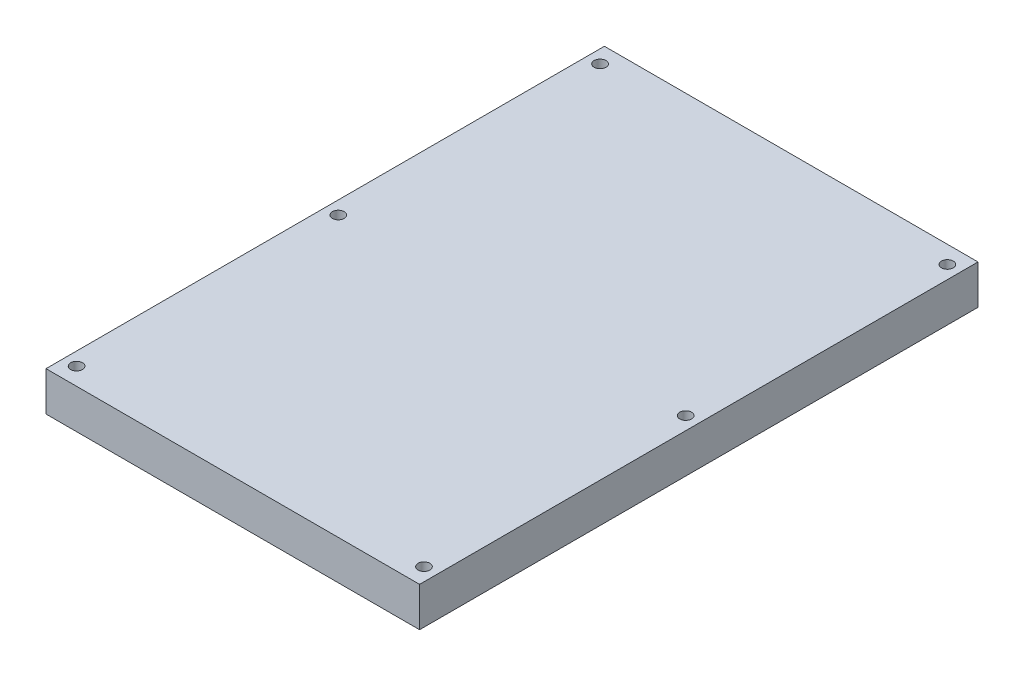
ISO-10303-21;
HEADER;
FILE_DESCRIPTION(('STEP AP214'),'2;1');
FILE_NAME('part.step','',(''),(''),'','','');
FILE_SCHEMA(('AUTOMOTIVE_DESIGN { 1 0 10303 214 1 1 1 1 }'));
ENDSEC;
DATA;
#1=APPLICATION_CONTEXT('core data for automotive mechanical design processes');
#2=APPLICATION_PROTOCOL_DEFINITION('international standard','automotive_design',2000,#1);
#3=PRODUCT_CONTEXT('',#1,'mechanical');
#4=PRODUCT('Part','Part','',(#3));
#5=PRODUCT_RELATED_PRODUCT_CATEGORY('part','',(#4));
#6=PRODUCT_DEFINITION_FORMATION('','',#4);
#7=PRODUCT_DEFINITION_CONTEXT('part definition',#1,'design');
#8=PRODUCT_DEFINITION('design','',#6,#7);
#9=PRODUCT_DEFINITION_SHAPE('','',#8);
#10=(LENGTH_UNIT() NAMED_UNIT(*) SI_UNIT(.MILLI.,.METRE.));
#11=(NAMED_UNIT(*) PLANE_ANGLE_UNIT() SI_UNIT($,.RADIAN.));
#12=(NAMED_UNIT(*) SI_UNIT($,.STERADIAN.) SOLID_ANGLE_UNIT());
#13=UNCERTAINTY_MEASURE_WITH_UNIT(LENGTH_MEASURE(1.E-05),#10,'distance_accuracy_value','');
#14=(GEOMETRIC_REPRESENTATION_CONTEXT(3) GLOBAL_UNCERTAINTY_ASSIGNED_CONTEXT((#13)) GLOBAL_UNIT_ASSIGNED_CONTEXT((#10,
#11,#12)) REPRESENTATION_CONTEXT('',''));
#15=CARTESIAN_POINT('',(0.,0.,0.));
#16=DIRECTION('',(0.,0.,1.));
#17=DIRECTION('',(1.,0.,0.));
#18=AXIS2_PLACEMENT_3D('',#15,#16,#17);
#19=CARTESIAN_POINT('',(82.5,9.,-123.8));
#20=DIRECTION('',(0.,1.,0.));
#21=DIRECTION('',(0.,0.,1.));
#22=AXIS2_PLACEMENT_3D('',#19,#20,#21);
#23=CYLINDRICAL_SURFACE('',#22,1.35254999999999);
#24=CARTESIAN_POINT('',(82.5,0.,-123.8));
#25=DIRECTION('',(0.,1.,0.));
#26=DIRECTION('',(0.,0.,1.));
#27=AXIS2_PLACEMENT_3D('',#24,#25,#26);
#28=CIRCLE('',#27,1.35254999999999);
#29=CARTESIAN_POINT('',(82.5,0.,-122.44745));
#30=VERTEX_POINT('',#29);
#31=EDGE_CURVE('E43',#30,#30,#28,.T.);
#32=ORIENTED_EDGE('',*,*,#31,.F.);
#33=EDGE_LOOP('',(#32));
#34=FACE_BOUND('',#33,.T.);
#35=CARTESIAN_POINT('',(82.5,9.,-123.8));
#36=DIRECTION('',(0.,1.,0.));
#37=DIRECTION('',(0.,0.,1.));
#38=AXIS2_PLACEMENT_3D('',#35,#36,#37);
#39=CIRCLE('',#38,1.35254999999999);
#40=CARTESIAN_POINT('',(82.5,9.,-122.44745));
#41=VERTEX_POINT('',#40);
#42=EDGE_CURVE('E11',#41,#41,#39,.T.);
#43=ORIENTED_EDGE('',*,*,#42,.T.);
#44=EDGE_LOOP('',(#43));
#45=FACE_BOUND('',#44,.T.);
#46=ADVANCED_FACE('F35',(#34,#45),#23,.F.);
#47=CARTESIAN_POINT('',(0.,9.,0.));
#48=DIRECTION('',(1.,0.,0.));
#49=DIRECTION('',(0.,0.,-1.));
#50=AXIS2_PLACEMENT_3D('',#47,#48,#49);
#51=PLANE('',#50);
#52=DIRECTION('',(0.,0.,1.));
#53=VECTOR('',#52,1.);
#54=CARTESIAN_POINT('',(0.,0.,0.));
#55=LINE('',#54,#53);
#56=CARTESIAN_POINT('',(0.,0.,-127.8));
#57=VERTEX_POINT('',#56);
#58=CARTESIAN_POINT('',(0.,0.,0.));
#59=VERTEX_POINT('',#58);
#60=EDGE_CURVE('E103',#57,#59,#55,.T.);
#61=ORIENTED_EDGE('',*,*,#60,.T.);
#62=DIRECTION('',(0.,-1.,0.));
#63=VECTOR('',#62,1.);
#64=CARTESIAN_POINT('',(0.,9.,0.));
#65=LINE('',#64,#63);
#66=CARTESIAN_POINT('',(0.,9.,0.));
#67=VERTEX_POINT('',#66);
#68=EDGE_CURVE('E94',#67,#59,#65,.T.);
#69=ORIENTED_EDGE('',*,*,#68,.F.);
#70=DIRECTION('',(0.,0.,1.));
#71=VECTOR('',#70,1.);
#72=CARTESIAN_POINT('',(0.,9.,0.));
#73=LINE('',#72,#71);
#74=CARTESIAN_POINT('',(0.,9.,-127.8));
#75=VERTEX_POINT('',#74);
#76=EDGE_CURVE('E88',#75,#67,#73,.T.);
#77=ORIENTED_EDGE('',*,*,#76,.F.);
#78=DIRECTION('',(0.,-1.,0.));
#79=VECTOR('',#78,1.);
#80=CARTESIAN_POINT('',(0.,9.,-127.8));
#81=LINE('',#80,#79);
#82=EDGE_CURVE('E99',#75,#57,#81,.T.);
#83=ORIENTED_EDGE('',*,*,#82,.T.);
#84=EDGE_LOOP('',(#61,#69,#77,#83));
#85=FACE_BOUND('',#84,.T.);
#86=ADVANCED_FACE('F119',(#85),#51,.F.);
#87=CARTESIAN_POINT('',(0.,9.,0.));
#88=DIRECTION('',(0.,0.,-1.));
#89=DIRECTION('',(-1.,0.,0.));
#90=AXIS2_PLACEMENT_3D('',#87,#88,#89);
#91=PLANE('',#90);
#92=DIRECTION('',(1.,0.,0.));
#93=VECTOR('',#92,1.);
#94=CARTESIAN_POINT('',(0.,0.,0.));
#95=LINE('',#94,#93);
#96=CARTESIAN_POINT('',(85.5,0.,0.));
#97=VERTEX_POINT('',#96);
#98=EDGE_CURVE('E93',#59,#97,#95,.T.);
#99=ORIENTED_EDGE('',*,*,#98,.T.);
#100=DIRECTION('',(0.,-1.,0.));
#101=VECTOR('',#100,1.);
#102=CARTESIAN_POINT('',(85.5,9.,0.));
#103=LINE('',#102,#101);
#104=CARTESIAN_POINT('',(85.5,9.,0.));
#105=VERTEX_POINT('',#104);
#106=EDGE_CURVE('E91',#105,#97,#103,.T.);
#107=ORIENTED_EDGE('',*,*,#106,.F.);
#108=DIRECTION('',(1.,0.,0.));
#109=VECTOR('',#108,1.);
#110=CARTESIAN_POINT('',(0.,9.,0.));
#111=LINE('',#110,#109);
#112=EDGE_CURVE('E82',#67,#105,#111,.T.);
#113=ORIENTED_EDGE('',*,*,#112,.F.);
#114=ORIENTED_EDGE('',*,*,#68,.T.);
#115=EDGE_LOOP('',(#99,#107,#113,#114));
#116=FACE_BOUND('',#115,.T.);
#117=ADVANCED_FACE('F92',(#116),#91,.F.);
#118=CARTESIAN_POINT('',(85.5,9.,0.));
#119=DIRECTION('',(-1.,0.,0.));
#120=DIRECTION('',(0.,0.,1.));
#121=AXIS2_PLACEMENT_3D('',#118,#119,#120);
#122=PLANE('',#121);
#123=DIRECTION('',(0.,0.,-1.));
#124=VECTOR('',#123,1.);
#125=CARTESIAN_POINT('',(85.5,0.,0.));
#126=LINE('',#125,#124);
#127=CARTESIAN_POINT('',(85.5,0.,-127.8));
#128=VERTEX_POINT('',#127);
#129=EDGE_CURVE('E68',#97,#128,#126,.T.);
#130=ORIENTED_EDGE('',*,*,#129,.T.);
#131=DIRECTION('',(0.,-1.,0.));
#132=VECTOR('',#131,1.);
#133=CARTESIAN_POINT('',(85.5,9.,-127.8));
#134=LINE('',#133,#132);
#135=CARTESIAN_POINT('',(85.5,9.,-127.8));
#136=VERTEX_POINT('',#135);
#137=EDGE_CURVE('E95',#136,#128,#134,.T.);
#138=ORIENTED_EDGE('',*,*,#137,.F.);
#139=DIRECTION('',(0.,0.,-1.));
#140=VECTOR('',#139,1.);
#141=CARTESIAN_POINT('',(85.5,9.,0.));
#142=LINE('',#141,#140);
#143=EDGE_CURVE('E86',#105,#136,#142,.T.);
#144=ORIENTED_EDGE('',*,*,#143,.F.);
#145=ORIENTED_EDGE('',*,*,#106,.T.);
#146=EDGE_LOOP('',(#130,#138,#144,#145));
#147=FACE_BOUND('',#146,.T.);
#148=ADVANCED_FACE('F97',(#147),#122,.F.);
#149=CARTESIAN_POINT('',(0.,9.,-127.8));
#150=DIRECTION('',(0.,0.,1.));
#151=DIRECTION('',(1.,0.,0.));
#152=AXIS2_PLACEMENT_3D('',#149,#150,#151);
#153=PLANE('',#152);
#154=DIRECTION('',(-1.,0.,0.));
#155=VECTOR('',#154,1.);
#156=CARTESIAN_POINT('',(0.,0.,-127.8));
#157=LINE('',#156,#155);
#158=EDGE_CURVE('E74',#128,#57,#157,.T.);
#159=ORIENTED_EDGE('',*,*,#158,.T.);
#160=ORIENTED_EDGE('',*,*,#82,.F.);
#161=DIRECTION('',(-1.,0.,0.));
#162=VECTOR('',#161,1.);
#163=CARTESIAN_POINT('',(0.,9.,-127.8));
#164=LINE('',#163,#162);
#165=EDGE_CURVE('E51',#136,#75,#164,.T.);
#166=ORIENTED_EDGE('',*,*,#165,.F.);
#167=ORIENTED_EDGE('',*,*,#137,.T.);
#168=EDGE_LOOP('',(#159,#160,#166,#167));
#169=FACE_BOUND('',#168,.T.);
#170=ADVANCED_FACE('F122',(#169),#153,.F.);
#171=CARTESIAN_POINT('',(0.,9.,0.));
#172=DIRECTION('',(0.,-1.,0.));
#173=DIRECTION('',(0.,0.,-1.));
#174=AXIS2_PLACEMENT_3D('',#171,#172,#173);
#175=PLANE('',#174);
#176=CARTESIAN_POINT('',(3.,9.,-123.8));
#177=DIRECTION('',(0.,1.,0.));
#178=DIRECTION('',(0.,0.,1.));
#179=AXIS2_PLACEMENT_3D('',#176,#177,#178);
#180=CIRCLE('',#179,1.35255);
#181=CARTESIAN_POINT('',(3.,9.,-122.44745));
#182=VERTEX_POINT('',#181);
#183=EDGE_CURVE('E174',#182,#182,#180,.T.);
#184=ORIENTED_EDGE('',*,*,#183,.F.);
#185=EDGE_LOOP('',(#184));
#186=FACE_BOUND('',#185,.T.);
#187=CARTESIAN_POINT('',(3.,9.,-63.9));
#188=DIRECTION('',(0.,1.,0.));
#189=DIRECTION('',(0.,0.,1.));
#190=AXIS2_PLACEMENT_3D('',#187,#188,#189);
#191=CIRCLE('',#190,1.35255);
#192=CARTESIAN_POINT('',(3.,9.,-62.54745));
#193=VERTEX_POINT('',#192);
#194=EDGE_CURVE('E168',#193,#193,#191,.T.);
#195=ORIENTED_EDGE('',*,*,#194,.F.);
#196=EDGE_LOOP('',(#195));
#197=FACE_BOUND('',#196,.T.);
#198=CARTESIAN_POINT('',(3.,9.,-4.));
#199=DIRECTION('',(0.,1.,0.));
#200=DIRECTION('',(0.,0.,1.));
#201=AXIS2_PLACEMENT_3D('',#198,#199,#200);
#202=CIRCLE('',#201,1.35255);
#203=CARTESIAN_POINT('',(3.,9.,-2.64745));
#204=VERTEX_POINT('',#203);
#205=EDGE_CURVE('E162',#204,#204,#202,.T.);
#206=ORIENTED_EDGE('',*,*,#205,.F.);
#207=EDGE_LOOP('',(#206));
#208=FACE_BOUND('',#207,.T.);
#209=CARTESIAN_POINT('',(82.5,9.,-63.9));
#210=DIRECTION('',(0.,1.,0.));
#211=DIRECTION('',(0.,0.,1.));
#212=AXIS2_PLACEMENT_3D('',#209,#210,#211);
#213=CIRCLE('',#212,1.35254999999999);
#214=CARTESIAN_POINT('',(82.5,9.,-62.54745));
#215=VERTEX_POINT('',#214);
#216=EDGE_CURVE('E153',#215,#215,#213,.T.);
#217=ORIENTED_EDGE('',*,*,#216,.F.);
#218=EDGE_LOOP('',(#217));
#219=FACE_BOUND('',#218,.T.);
#220=CARTESIAN_POINT('',(82.5,9.,-4.));
#221=DIRECTION('',(0.,1.,0.));
#222=DIRECTION('',(0.,0.,1.));
#223=AXIS2_PLACEMENT_3D('',#220,#221,#222);
#224=CIRCLE('',#223,1.35254999999999);
#225=CARTESIAN_POINT('',(82.5,9.,-2.64745000000001));
#226=VERTEX_POINT('',#225);
#227=EDGE_CURVE('E150',#226,#226,#224,.T.);
#228=ORIENTED_EDGE('',*,*,#227,.F.);
#229=EDGE_LOOP('',(#228));
#230=FACE_BOUND('',#229,.T.);
#231=ORIENTED_EDGE('',*,*,#76,.T.);
#232=ORIENTED_EDGE('',*,*,#112,.T.);
#233=ORIENTED_EDGE('',*,*,#143,.T.);
#234=ORIENTED_EDGE('',*,*,#165,.T.);
#235=EDGE_LOOP('',(#231,#232,#233,#234));
#236=FACE_BOUND('',#235,.T.);
#237=ORIENTED_EDGE('',*,*,#42,.F.);
#238=EDGE_LOOP('',(#237));
#239=FACE_BOUND('',#238,.T.);
#240=ADVANCED_FACE('F83',(#186,#197,#208,#219,#230,#236,#239),#175,.F.);
#241=CARTESIAN_POINT('',(0.,0.,0.));
#242=DIRECTION('',(0.,-1.,0.));
#243=DIRECTION('',(0.,0.,-1.));
#244=AXIS2_PLACEMENT_3D('',#241,#242,#243);
#245=PLANE('',#244);
#246=CARTESIAN_POINT('',(3.,0.,-123.8));
#247=DIRECTION('',(0.,1.,0.));
#248=DIRECTION('',(0.,0.,1.));
#249=AXIS2_PLACEMENT_3D('',#246,#247,#248);
#250=CIRCLE('',#249,1.35255);
#251=CARTESIAN_POINT('',(3.,0.,-122.44745));
#252=VERTEX_POINT('',#251);
#253=EDGE_CURVE('E171',#252,#252,#250,.T.);
#254=ORIENTED_EDGE('',*,*,#253,.T.);
#255=EDGE_LOOP('',(#254));
#256=FACE_BOUND('',#255,.T.);
#257=CARTESIAN_POINT('',(3.,0.,-63.9));
#258=DIRECTION('',(0.,1.,0.));
#259=DIRECTION('',(0.,0.,1.));
#260=AXIS2_PLACEMENT_3D('',#257,#258,#259);
#261=CIRCLE('',#260,1.35255);
#262=CARTESIAN_POINT('',(3.,0.,-62.54745));
#263=VERTEX_POINT('',#262);
#264=EDGE_CURVE('E165',#263,#263,#261,.T.);
#265=ORIENTED_EDGE('',*,*,#264,.T.);
#266=EDGE_LOOP('',(#265));
#267=FACE_BOUND('',#266,.T.);
#268=CARTESIAN_POINT('',(3.,0.,-4.));
#269=DIRECTION('',(0.,1.,0.));
#270=DIRECTION('',(0.,0.,1.));
#271=AXIS2_PLACEMENT_3D('',#268,#269,#270);
#272=CIRCLE('',#271,1.35255);
#273=CARTESIAN_POINT('',(3.,0.,-2.64745));
#274=VERTEX_POINT('',#273);
#275=EDGE_CURVE('E159',#274,#274,#272,.T.);
#276=ORIENTED_EDGE('',*,*,#275,.T.);
#277=EDGE_LOOP('',(#276));
#278=FACE_BOUND('',#277,.T.);
#279=CARTESIAN_POINT('',(82.5,0.,-63.9));
#280=DIRECTION('',(0.,1.,0.));
#281=DIRECTION('',(0.,0.,1.));
#282=AXIS2_PLACEMENT_3D('',#279,#280,#281);
#283=CIRCLE('',#282,1.35254999999999);
#284=CARTESIAN_POINT('',(82.5,0.,-62.54745));
#285=VERTEX_POINT('',#284);
#286=EDGE_CURVE('E156',#285,#285,#283,.T.);
#287=ORIENTED_EDGE('',*,*,#286,.T.);
#288=EDGE_LOOP('',(#287));
#289=FACE_BOUND('',#288,.T.);
#290=CARTESIAN_POINT('',(82.5,0.,-4.));
#291=DIRECTION('',(0.,1.,0.));
#292=DIRECTION('',(0.,0.,1.));
#293=AXIS2_PLACEMENT_3D('',#290,#291,#292);
#294=CIRCLE('',#293,1.35254999999999);
#295=CARTESIAN_POINT('',(82.5,0.,-2.64745000000001));
#296=VERTEX_POINT('',#295);
#297=EDGE_CURVE('E106',#296,#296,#294,.T.);
#298=ORIENTED_EDGE('',*,*,#297,.T.);
#299=EDGE_LOOP('',(#298));
#300=FACE_BOUND('',#299,.T.);
#301=ORIENTED_EDGE('',*,*,#60,.F.);
#302=ORIENTED_EDGE('',*,*,#158,.F.);
#303=ORIENTED_EDGE('',*,*,#129,.F.);
#304=ORIENTED_EDGE('',*,*,#98,.F.);
#305=EDGE_LOOP('',(#301,#302,#303,#304));
#306=FACE_BOUND('',#305,.T.);
#307=ORIENTED_EDGE('',*,*,#31,.T.);
#308=EDGE_LOOP('',(#307));
#309=FACE_BOUND('',#308,.T.);
#310=ADVANCED_FACE('F115',(#256,#267,#278,#289,#300,#306,#309),#245,.T.);
#311=CARTESIAN_POINT('',(82.5,9.,-4.));
#312=DIRECTION('',(0.,1.,0.));
#313=DIRECTION('',(0.,0.,1.));
#314=AXIS2_PLACEMENT_3D('',#311,#312,#313);
#315=CYLINDRICAL_SURFACE('',#314,1.35254999999999);
#316=ORIENTED_EDGE('',*,*,#297,.F.);
#317=EDGE_LOOP('',(#316));
#318=FACE_BOUND('',#317,.T.);
#319=ORIENTED_EDGE('',*,*,#227,.T.);
#320=EDGE_LOOP('',(#319));
#321=FACE_BOUND('',#320,.T.);
#322=ADVANCED_FACE('F129',(#318,#321),#315,.F.);
#323=CARTESIAN_POINT('',(82.5,9.,-63.9));
#324=DIRECTION('',(0.,1.,0.));
#325=DIRECTION('',(0.,0.,1.));
#326=AXIS2_PLACEMENT_3D('',#323,#324,#325);
#327=CYLINDRICAL_SURFACE('',#326,1.35254999999999);
#328=ORIENTED_EDGE('',*,*,#286,.F.);
#329=EDGE_LOOP('',(#328));
#330=FACE_BOUND('',#329,.T.);
#331=ORIENTED_EDGE('',*,*,#216,.T.);
#332=EDGE_LOOP('',(#331));
#333=FACE_BOUND('',#332,.T.);
#334=ADVANCED_FACE('F191',(#330,#333),#327,.F.);
#335=CARTESIAN_POINT('',(3.,9.,-4.));
#336=DIRECTION('',(0.,1.,0.));
#337=DIRECTION('',(0.,0.,1.));
#338=AXIS2_PLACEMENT_3D('',#335,#336,#337);
#339=CYLINDRICAL_SURFACE('',#338,1.35255);
#340=ORIENTED_EDGE('',*,*,#275,.F.);
#341=EDGE_LOOP('',(#340));
#342=FACE_BOUND('',#341,.T.);
#343=ORIENTED_EDGE('',*,*,#205,.T.);
#344=EDGE_LOOP('',(#343));
#345=FACE_BOUND('',#344,.T.);
#346=ADVANCED_FACE('F185',(#342,#345),#339,.F.);
#347=CARTESIAN_POINT('',(3.,9.,-63.9));
#348=DIRECTION('',(0.,1.,0.));
#349=DIRECTION('',(0.,0.,1.));
#350=AXIS2_PLACEMENT_3D('',#347,#348,#349);
#351=CYLINDRICAL_SURFACE('',#350,1.35255);
#352=ORIENTED_EDGE('',*,*,#264,.F.);
#353=EDGE_LOOP('',(#352));
#354=FACE_BOUND('',#353,.T.);
#355=ORIENTED_EDGE('',*,*,#194,.T.);
#356=EDGE_LOOP('',(#355));
#357=FACE_BOUND('',#356,.T.);
#358=ADVANCED_FACE('F179',(#354,#357),#351,.F.);
#359=CARTESIAN_POINT('',(3.,9.,-123.8));
#360=DIRECTION('',(0.,1.,0.));
#361=DIRECTION('',(0.,0.,1.));
#362=AXIS2_PLACEMENT_3D('',#359,#360,#361);
#363=CYLINDRICAL_SURFACE('',#362,1.35255);
#364=ORIENTED_EDGE('',*,*,#253,.F.);
#365=EDGE_LOOP('',(#364));
#366=FACE_BOUND('',#365,.T.);
#367=ORIENTED_EDGE('',*,*,#183,.T.);
#368=EDGE_LOOP('',(#367));
#369=FACE_BOUND('',#368,.T.);
#370=ADVANCED_FACE('F177',(#366,#369),#363,.F.);
#371=CLOSED_SHELL('',(#46,#86,#117,#148,#170,#240,#310,#322,#334,#346,#358,#370));
#372=MANIFOLD_SOLID_BREP('B2',#371);
#373=ADVANCED_BREP_SHAPE_REPRESENTATION('',(#18,#372),#14);
#374=SHAPE_DEFINITION_REPRESENTATION(#9,#373);
ENDSEC;
END-ISO-10303-21;
